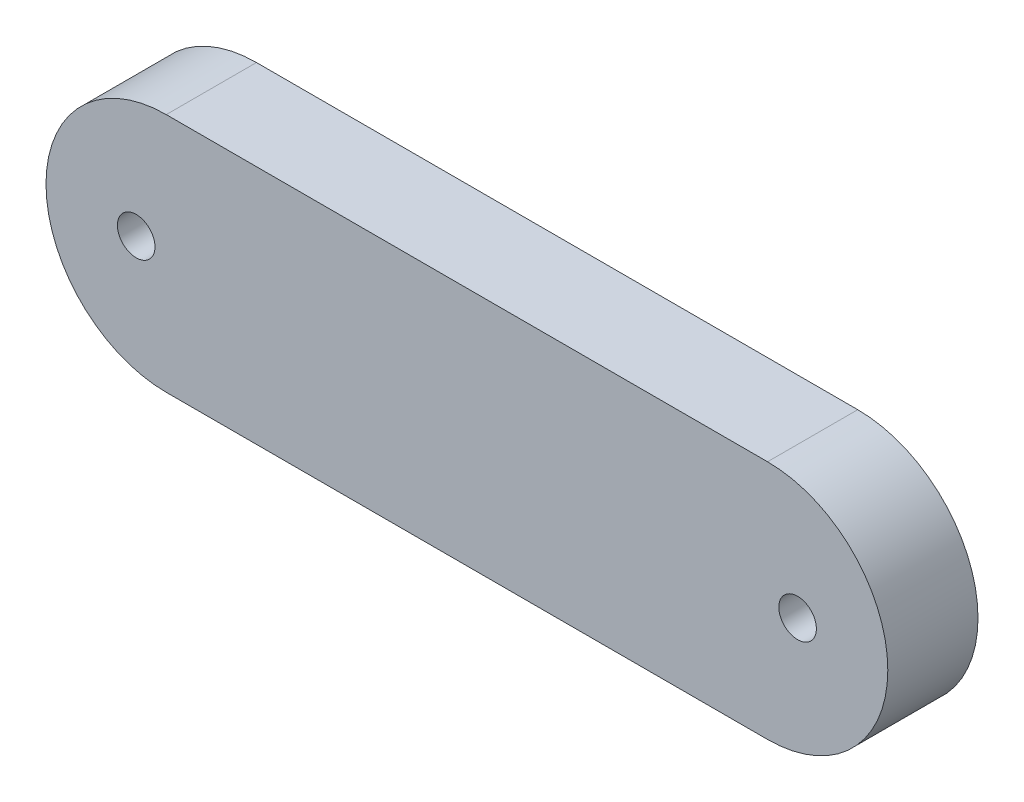
ISO-10303-21;
HEADER;
FILE_DESCRIPTION(('STEP AP214'),'2;1');
FILE_NAME('part.step','',(''),(''),'','','');
FILE_SCHEMA(('AUTOMOTIVE_DESIGN { 1 0 10303 214 1 1 1 1 }'));
ENDSEC;
DATA;
#1=APPLICATION_CONTEXT('core data for automotive mechanical design processes');
#2=APPLICATION_PROTOCOL_DEFINITION('international standard','automotive_design',2000,#1);
#3=PRODUCT_CONTEXT('',#1,'mechanical');
#4=PRODUCT('Part','Part','',(#3));
#5=PRODUCT_RELATED_PRODUCT_CATEGORY('part','',(#4));
#6=PRODUCT_DEFINITION_FORMATION('','',#4);
#7=PRODUCT_DEFINITION_CONTEXT('part definition',#1,'design');
#8=PRODUCT_DEFINITION('design','',#6,#7);
#9=PRODUCT_DEFINITION_SHAPE('','',#8);
#10=(LENGTH_UNIT() NAMED_UNIT(*) SI_UNIT(.MILLI.,.METRE.));
#11=(NAMED_UNIT(*) PLANE_ANGLE_UNIT() SI_UNIT($,.RADIAN.));
#12=(NAMED_UNIT(*) SI_UNIT($,.STERADIAN.) SOLID_ANGLE_UNIT());
#13=UNCERTAINTY_MEASURE_WITH_UNIT(LENGTH_MEASURE(1.E-05),#10,'distance_accuracy_value','');
#14=(GEOMETRIC_REPRESENTATION_CONTEXT(3) GLOBAL_UNCERTAINTY_ASSIGNED_CONTEXT((#13)) GLOBAL_UNIT_ASSIGNED_CONTEXT((#10,
#11,#12)) REPRESENTATION_CONTEXT('',''));
#15=CARTESIAN_POINT('',(0.,0.,0.));
#16=DIRECTION('',(0.,0.,1.));
#17=DIRECTION('',(1.,0.,0.));
#18=AXIS2_PLACEMENT_3D('',#15,#16,#17);
#19=CARTESIAN_POINT('',(63.5,0.,9.525));
#20=DIRECTION('',(0.,0.,-1.));
#21=DIRECTION('',(-1.,0.,0.));
#22=AXIS2_PLACEMENT_3D('',#19,#20,#21);
#23=PLANE('',#22);
#24=CARTESIAN_POINT('',(63.5,0.,9.525));
#25=DIRECTION('',(0.,0.,1.));
#26=DIRECTION('',(-1.,0.,0.));
#27=AXIS2_PLACEMENT_3D('',#24,#25,#26);
#28=CIRCLE('',#27,25.4);
#29=CARTESIAN_POINT('',(63.5,-25.4,9.525));
#30=VERTEX_POINT('',#29);
#31=CARTESIAN_POINT('',(63.5,25.4,9.525));
#32=VERTEX_POINT('',#31);
#33=EDGE_CURVE('E92',#30,#32,#28,.T.);
#34=ORIENTED_EDGE('',*,*,#33,.T.);
#35=DIRECTION('',(-1.,0.,0.));
#36=VECTOR('',#35,1.);
#37=CARTESIAN_POINT('',(-63.5,25.4,9.525));
#38=LINE('',#37,#36);
#39=CARTESIAN_POINT('',(-63.5,25.4,9.525));
#40=VERTEX_POINT('',#39);
#41=EDGE_CURVE('E87',#32,#40,#38,.T.);
#42=ORIENTED_EDGE('',*,*,#41,.T.);
#43=CARTESIAN_POINT('',(-63.5,0.,9.525));
#44=DIRECTION('',(0.,0.,1.));
#45=DIRECTION('',(1.,0.,0.));
#46=AXIS2_PLACEMENT_3D('',#43,#44,#45);
#47=CIRCLE('',#46,25.4);
#48=CARTESIAN_POINT('',(-63.5,-25.4,9.525));
#49=VERTEX_POINT('',#48);
#50=EDGE_CURVE('E90',#40,#49,#47,.T.);
#51=ORIENTED_EDGE('',*,*,#50,.T.);
#52=DIRECTION('',(1.,0.,0.));
#53=VECTOR('',#52,1.);
#54=CARTESIAN_POINT('',(-63.5,-25.4,9.525));
#55=LINE('',#54,#53);
#56=EDGE_CURVE('E57',#49,#30,#55,.T.);
#57=ORIENTED_EDGE('',*,*,#56,.T.);
#58=EDGE_LOOP('',(#34,#42,#51,#57));
#59=FACE_BOUND('',#58,.T.);
#60=CARTESIAN_POINT('',(-69.85,0.,9.525));
#61=DIRECTION('',(0.,0.,1.));
#62=DIRECTION('',(1.,0.,0.));
#63=AXIS2_PLACEMENT_3D('',#60,#61,#62);
#64=CIRCLE('',#63,3.96875);
#65=CARTESIAN_POINT('',(-73.81875,0.,9.525));
#66=VERTEX_POINT('',#65);
#67=EDGE_CURVE('E112',#66,#66,#64,.T.);
#68=ORIENTED_EDGE('',*,*,#67,.F.);
#69=EDGE_LOOP('',(#68));
#70=FACE_BOUND('',#69,.T.);
#71=CARTESIAN_POINT('',(69.85,0.,9.525));
#72=DIRECTION('',(0.,0.,1.));
#73=DIRECTION('',(1.,0.,0.));
#74=AXIS2_PLACEMENT_3D('',#71,#72,#73);
#75=CIRCLE('',#74,3.96875);
#76=CARTESIAN_POINT('',(65.88125,0.,9.525));
#77=VERTEX_POINT('',#76);
#78=EDGE_CURVE('E134',#77,#77,#75,.T.);
#79=ORIENTED_EDGE('',*,*,#78,.F.);
#80=EDGE_LOOP('',(#79));
#81=FACE_BOUND('',#80,.T.);
#82=ADVANCED_FACE('F39',(#59,#70,#81),#23,.F.);
#83=CARTESIAN_POINT('',(63.5,0.,-9.525));
#84=DIRECTION('',(0.,0.,-1.));
#85=DIRECTION('',(-1.,0.,0.));
#86=AXIS2_PLACEMENT_3D('',#83,#84,#85);
#87=PLANE('',#86);
#88=CARTESIAN_POINT('',(-69.85,0.,-9.525));
#89=DIRECTION('',(0.,0.,1.));
#90=DIRECTION('',(1.,0.,0.));
#91=AXIS2_PLACEMENT_3D('',#88,#89,#90);
#92=CIRCLE('',#91,3.96875);
#93=CARTESIAN_POINT('',(-73.81875,0.,-9.525));
#94=VERTEX_POINT('',#93);
#95=EDGE_CURVE('E130',#94,#94,#92,.T.);
#96=ORIENTED_EDGE('',*,*,#95,.T.);
#97=EDGE_LOOP('',(#96));
#98=FACE_BOUND('',#97,.T.);
#99=CARTESIAN_POINT('',(63.5,0.,-9.525));
#100=DIRECTION('',(0.,0.,1.));
#101=DIRECTION('',(-1.,0.,0.));
#102=AXIS2_PLACEMENT_3D('',#99,#100,#101);
#103=CIRCLE('',#102,25.4);
#104=CARTESIAN_POINT('',(63.5,-25.4,-9.525));
#105=VERTEX_POINT('',#104);
#106=CARTESIAN_POINT('',(63.5,25.4,-9.525));
#107=VERTEX_POINT('',#106);
#108=EDGE_CURVE('E108',#105,#107,#103,.T.);
#109=ORIENTED_EDGE('',*,*,#108,.F.);
#110=DIRECTION('',(1.,0.,0.));
#111=VECTOR('',#110,1.);
#112=CARTESIAN_POINT('',(-63.5,-25.4,-9.525));
#113=LINE('',#112,#111);
#114=CARTESIAN_POINT('',(-63.5,-25.4,-9.525));
#115=VERTEX_POINT('',#114);
#116=EDGE_CURVE('E80',#115,#105,#113,.T.);
#117=ORIENTED_EDGE('',*,*,#116,.F.);
#118=CARTESIAN_POINT('',(-63.5,0.,-9.525));
#119=DIRECTION('',(0.,0.,1.));
#120=DIRECTION('',(1.,0.,0.));
#121=AXIS2_PLACEMENT_3D('',#118,#119,#120);
#122=CIRCLE('',#121,25.4);
#123=CARTESIAN_POINT('',(-63.5,25.4,-9.525));
#124=VERTEX_POINT('',#123);
#125=EDGE_CURVE('E74',#124,#115,#122,.T.);
#126=ORIENTED_EDGE('',*,*,#125,.F.);
#127=DIRECTION('',(-1.,0.,0.));
#128=VECTOR('',#127,1.);
#129=CARTESIAN_POINT('',(-63.5,25.4,-9.525));
#130=LINE('',#129,#128);
#131=EDGE_CURVE('E97',#107,#124,#130,.T.);
#132=ORIENTED_EDGE('',*,*,#131,.F.);
#133=EDGE_LOOP('',(#109,#117,#126,#132));
#134=FACE_BOUND('',#133,.T.);
#135=CARTESIAN_POINT('',(69.85,0.,-9.525));
#136=DIRECTION('',(0.,0.,1.));
#137=DIRECTION('',(1.,0.,0.));
#138=AXIS2_PLACEMENT_3D('',#135,#136,#137);
#139=CIRCLE('',#138,3.96875);
#140=CARTESIAN_POINT('',(65.88125,0.,-9.525));
#141=VERTEX_POINT('',#140);
#142=EDGE_CURVE('E138',#141,#141,#139,.T.);
#143=ORIENTED_EDGE('',*,*,#142,.T.);
#144=EDGE_LOOP('',(#143));
#145=FACE_BOUND('',#144,.T.);
#146=ADVANCED_FACE('F125',(#98,#134,#145),#87,.T.);
#147=CARTESIAN_POINT('',(63.5,0.,9.525));
#148=DIRECTION('',(0.,0.,-1.));
#149=DIRECTION('',(-1.,0.,0.));
#150=AXIS2_PLACEMENT_3D('',#147,#148,#149);
#151=CYLINDRICAL_SURFACE('',#150,25.4);
#152=ORIENTED_EDGE('',*,*,#108,.T.);
#153=DIRECTION('',(0.,0.,-1.));
#154=VECTOR('',#153,1.);
#155=CARTESIAN_POINT('',(63.5,25.4,9.525));
#156=LINE('',#155,#154);
#157=EDGE_CURVE('E11',#32,#107,#156,.T.);
#158=ORIENTED_EDGE('',*,*,#157,.F.);
#159=ORIENTED_EDGE('',*,*,#33,.F.);
#160=DIRECTION('',(0.,0.,-1.));
#161=VECTOR('',#160,1.);
#162=CARTESIAN_POINT('',(63.5,-25.4,9.525));
#163=LINE('',#162,#161);
#164=EDGE_CURVE('E104',#30,#105,#163,.T.);
#165=ORIENTED_EDGE('',*,*,#164,.T.);
#166=EDGE_LOOP('',(#152,#158,#159,#165));
#167=FACE_BOUND('',#166,.T.);
#168=ADVANCED_FACE('F41',(#167),#151,.T.);
#169=CARTESIAN_POINT('',(-63.5,25.4,9.525));
#170=DIRECTION('',(0.,-1.,0.));
#171=DIRECTION('',(1.,0.,0.));
#172=AXIS2_PLACEMENT_3D('',#169,#170,#171);
#173=PLANE('',#172);
#174=ORIENTED_EDGE('',*,*,#131,.T.);
#175=DIRECTION('',(0.,0.,-1.));
#176=VECTOR('',#175,1.);
#177=CARTESIAN_POINT('',(-63.5,25.4,9.525));
#178=LINE('',#177,#176);
#179=EDGE_CURVE('E49',#40,#124,#178,.T.);
#180=ORIENTED_EDGE('',*,*,#179,.F.);
#181=ORIENTED_EDGE('',*,*,#41,.F.);
#182=ORIENTED_EDGE('',*,*,#157,.T.);
#183=EDGE_LOOP('',(#174,#180,#181,#182));
#184=FACE_BOUND('',#183,.T.);
#185=ADVANCED_FACE('F96',(#184),#173,.F.);
#186=CARTESIAN_POINT('',(-63.5,0.,9.525));
#187=DIRECTION('',(0.,0.,-1.));
#188=DIRECTION('',(-1.,0.,0.));
#189=AXIS2_PLACEMENT_3D('',#186,#187,#188);
#190=CYLINDRICAL_SURFACE('',#189,25.4);
#191=ORIENTED_EDGE('',*,*,#125,.T.);
#192=DIRECTION('',(0.,0.,-1.));
#193=VECTOR('',#192,1.);
#194=CARTESIAN_POINT('',(-63.5,-25.4,9.525));
#195=LINE('',#194,#193);
#196=EDGE_CURVE('E99',#49,#115,#195,.T.);
#197=ORIENTED_EDGE('',*,*,#196,.F.);
#198=ORIENTED_EDGE('',*,*,#50,.F.);
#199=ORIENTED_EDGE('',*,*,#179,.T.);
#200=EDGE_LOOP('',(#191,#197,#198,#199));
#201=FACE_BOUND('',#200,.T.);
#202=ADVANCED_FACE('F100',(#201),#190,.T.);
#203=CARTESIAN_POINT('',(-63.5,-25.4,9.525));
#204=DIRECTION('',(0.,1.,0.));
#205=DIRECTION('',(-1.,0.,0.));
#206=AXIS2_PLACEMENT_3D('',#203,#204,#205);
#207=PLANE('',#206);
#208=ORIENTED_EDGE('',*,*,#116,.T.);
#209=ORIENTED_EDGE('',*,*,#164,.F.);
#210=ORIENTED_EDGE('',*,*,#56,.F.);
#211=ORIENTED_EDGE('',*,*,#196,.T.);
#212=EDGE_LOOP('',(#208,#209,#210,#211));
#213=FACE_BOUND('',#212,.T.);
#214=ADVANCED_FACE('F122',(#213),#207,.F.);
#215=CARTESIAN_POINT('',(-69.85,0.,9.525));
#216=DIRECTION('',(0.,0.,-1.));
#217=DIRECTION('',(-1.,0.,0.));
#218=AXIS2_PLACEMENT_3D('',#215,#216,#217);
#219=CYLINDRICAL_SURFACE('',#218,3.96875);
#220=CARTESIAN_POINT('',(-73.81875,0.,9.525));
#221=CARTESIAN_POINT('',(-73.81875,0.,9.3265625));
#222=CARTESIAN_POINT('',(-73.81875,0.,9.128125));
#223=CARTESIAN_POINT('',(-73.81875,0.,8.73125));
#224=CARTESIAN_POINT('',(-73.81875,0.,8.5328125));
#225=CARTESIAN_POINT('',(-73.81875,0.,8.1359375));
#226=CARTESIAN_POINT('',(-73.81875,0.,7.9375));
#227=CARTESIAN_POINT('',(-73.81875,0.,7.540625));
#228=CARTESIAN_POINT('',(-73.81875,0.,7.3421875));
#229=CARTESIAN_POINT('',(-73.81875,0.,6.9453125));
#230=CARTESIAN_POINT('',(-73.81875,0.,6.746875));
#231=CARTESIAN_POINT('',(-73.81875,0.,6.35));
#232=CARTESIAN_POINT('',(-73.81875,0.,6.1515625));
#233=CARTESIAN_POINT('',(-73.81875,0.,5.7546875));
#234=CARTESIAN_POINT('',(-73.81875,0.,5.55625));
#235=CARTESIAN_POINT('',(-73.81875,0.,5.159375));
#236=CARTESIAN_POINT('',(-73.81875,0.,4.9609375));
#237=CARTESIAN_POINT('',(-73.81875,0.,4.5640625));
#238=CARTESIAN_POINT('',(-73.81875,0.,4.365625));
#239=CARTESIAN_POINT('',(-73.81875,0.,3.96875));
#240=CARTESIAN_POINT('',(-73.81875,0.,3.7703125));
#241=CARTESIAN_POINT('',(-73.81875,0.,3.3734375));
#242=CARTESIAN_POINT('',(-73.81875,0.,3.175));
#243=CARTESIAN_POINT('',(-73.81875,0.,2.778125));
#244=CARTESIAN_POINT('',(-73.81875,0.,2.5796875));
#245=CARTESIAN_POINT('',(-73.81875,0.,2.1828125));
#246=CARTESIAN_POINT('',(-73.81875,0.,1.984375));
#247=CARTESIAN_POINT('',(-73.81875,0.,1.5875));
#248=CARTESIAN_POINT('',(-73.81875,0.,1.3890625));
#249=CARTESIAN_POINT('',(-73.81875,0.,0.992187500000001));
#250=CARTESIAN_POINT('',(-73.81875,0.,0.793750000000001));
#251=CARTESIAN_POINT('',(-73.81875,0.,0.396875));
#252=CARTESIAN_POINT('',(-73.81875,0.,0.1984375));
#253=CARTESIAN_POINT('',(-73.81875,0.,-0.1984375));
#254=CARTESIAN_POINT('',(-73.81875,0.,-0.396875));
#255=CARTESIAN_POINT('',(-73.81875,0.,-0.793750000000001));
#256=CARTESIAN_POINT('',(-73.81875,0.,-0.992187500000001));
#257=CARTESIAN_POINT('',(-73.81875,0.,-1.3890625));
#258=CARTESIAN_POINT('',(-73.81875,0.,-1.5875));
#259=CARTESIAN_POINT('',(-73.81875,0.,-1.984375));
#260=CARTESIAN_POINT('',(-73.81875,0.,-2.1828125));
#261=CARTESIAN_POINT('',(-73.81875,0.,-2.5796875));
#262=CARTESIAN_POINT('',(-73.81875,0.,-2.778125));
#263=CARTESIAN_POINT('',(-73.81875,0.,-3.175));
#264=CARTESIAN_POINT('',(-73.81875,0.,-3.3734375));
#265=CARTESIAN_POINT('',(-73.81875,0.,-3.7703125));
#266=CARTESIAN_POINT('',(-73.81875,0.,-3.96875));
#267=CARTESIAN_POINT('',(-73.81875,0.,-4.365625));
#268=CARTESIAN_POINT('',(-73.81875,0.,-4.5640625));
#269=CARTESIAN_POINT('',(-73.81875,0.,-4.9609375));
#270=CARTESIAN_POINT('',(-73.81875,0.,-5.159375));
#271=CARTESIAN_POINT('',(-73.81875,0.,-5.55625));
#272=CARTESIAN_POINT('',(-73.81875,0.,-5.7546875));
#273=CARTESIAN_POINT('',(-73.81875,0.,-6.1515625));
#274=CARTESIAN_POINT('',(-73.81875,0.,-6.35));
#275=CARTESIAN_POINT('',(-73.81875,0.,-6.746875));
#276=CARTESIAN_POINT('',(-73.81875,0.,-6.9453125));
#277=CARTESIAN_POINT('',(-73.81875,0.,-7.3421875));
#278=CARTESIAN_POINT('',(-73.81875,0.,-7.540625));
#279=CARTESIAN_POINT('',(-73.81875,0.,-7.9375));
#280=CARTESIAN_POINT('',(-73.81875,0.,-8.1359375));
#281=CARTESIAN_POINT('',(-73.81875,0.,-8.5328125));
#282=CARTESIAN_POINT('',(-73.81875,0.,-8.73125));
#283=CARTESIAN_POINT('',(-73.81875,0.,-9.128125));
#284=CARTESIAN_POINT('',(-73.81875,0.,-9.3265625));
#285=CARTESIAN_POINT('',(-73.81875,0.,-9.525));
#286=B_SPLINE_CURVE_WITH_KNOTS('',3,(#220,#221,#222,#223,#224,#225,#226,#227,#228,#229,#230,
#231,#232,#233,#234,#235,#236,#237,#238,#239,#240,#241,#242,#243,#244,#245,#246,#247,#248,#249,
#250,#251,#252,#253,#254,#255,#256,#257,#258,#259,#260,#261,#262,#263,#264,#265,#266,#267,#268,
#269,#270,#271,#272,#273,#274,#275,#276,#277,#278,#279,#280,#281,#282,#283,#284,#285),
.UNSPECIFIED.,.F.,.F.,(4,2,2,2,2,2,2,2,2,2,2,2,2,2,2,2,2,2,2,2,2,2,2,2,2,2,2,2,2,2,2,2,4),(0.,
0.5953125,1.190625,1.7859375,2.38125,2.9765625,3.571875,4.1671875,4.7625,5.3578125,5.953125,
6.5484375,7.14375,7.7390625,8.334375,8.9296875,9.525,10.1203125,10.715625,11.3109375,11.90625,
12.5015625,13.096875,13.6921875,14.2875,14.8828125,15.478125,16.0734375,16.66875,17.2640625,
17.859375,18.4546875,19.05),.UNSPECIFIED.);
#287=EDGE_CURVE('BSEAM157',#66,#94,#286,.T.);
#288=ORIENTED_EDGE('',*,*,#67,.T.);
#289=ORIENTED_EDGE('',*,*,#95,.F.);
#290=ORIENTED_EDGE('',*,*,#287,.T.);
#291=ORIENTED_EDGE('',*,*,#287,.F.);
#292=EDGE_LOOP('',(#288,#290,#289,#291));
#293=FACE_BOUND('',#292,.T.);
#294=ADVANCED_FACE('F157',(#293),#219,.F.);
#295=CARTESIAN_POINT('',(69.85,0.,9.525));
#296=DIRECTION('',(0.,0.,-1.));
#297=DIRECTION('',(-1.,0.,0.));
#298=AXIS2_PLACEMENT_3D('',#295,#296,#297);
#299=CYLINDRICAL_SURFACE('',#298,3.96875);
#300=CARTESIAN_POINT('',(65.88125,0.,9.525));
#301=CARTESIAN_POINT('',(65.88125,0.,9.3265625));
#302=CARTESIAN_POINT('',(65.88125,0.,9.128125));
#303=CARTESIAN_POINT('',(65.88125,0.,8.73125));
#304=CARTESIAN_POINT('',(65.88125,0.,8.5328125));
#305=CARTESIAN_POINT('',(65.88125,0.,8.1359375));
#306=CARTESIAN_POINT('',(65.88125,0.,7.9375));
#307=CARTESIAN_POINT('',(65.88125,0.,7.540625));
#308=CARTESIAN_POINT('',(65.88125,0.,7.3421875));
#309=CARTESIAN_POINT('',(65.88125,0.,6.9453125));
#310=CARTESIAN_POINT('',(65.88125,0.,6.746875));
#311=CARTESIAN_POINT('',(65.88125,0.,6.35));
#312=CARTESIAN_POINT('',(65.88125,0.,6.1515625));
#313=CARTESIAN_POINT('',(65.88125,0.,5.7546875));
#314=CARTESIAN_POINT('',(65.88125,0.,5.55625));
#315=CARTESIAN_POINT('',(65.88125,0.,5.159375));
#316=CARTESIAN_POINT('',(65.88125,0.,4.9609375));
#317=CARTESIAN_POINT('',(65.88125,0.,4.5640625));
#318=CARTESIAN_POINT('',(65.88125,0.,4.365625));
#319=CARTESIAN_POINT('',(65.88125,0.,3.96875));
#320=CARTESIAN_POINT('',(65.88125,0.,3.7703125));
#321=CARTESIAN_POINT('',(65.88125,0.,3.3734375));
#322=CARTESIAN_POINT('',(65.88125,0.,3.175));
#323=CARTESIAN_POINT('',(65.88125,0.,2.778125));
#324=CARTESIAN_POINT('',(65.88125,0.,2.5796875));
#325=CARTESIAN_POINT('',(65.88125,0.,2.1828125));
#326=CARTESIAN_POINT('',(65.88125,0.,1.984375));
#327=CARTESIAN_POINT('',(65.88125,0.,1.5875));
#328=CARTESIAN_POINT('',(65.88125,0.,1.3890625));
#329=CARTESIAN_POINT('',(65.88125,0.,0.992187500000001));
#330=CARTESIAN_POINT('',(65.88125,0.,0.793750000000001));
#331=CARTESIAN_POINT('',(65.88125,0.,0.396875));
#332=CARTESIAN_POINT('',(65.88125,0.,0.1984375));
#333=CARTESIAN_POINT('',(65.88125,0.,-0.1984375));
#334=CARTESIAN_POINT('',(65.88125,0.,-0.396875));
#335=CARTESIAN_POINT('',(65.88125,0.,-0.793750000000001));
#336=CARTESIAN_POINT('',(65.88125,0.,-0.992187500000001));
#337=CARTESIAN_POINT('',(65.88125,0.,-1.3890625));
#338=CARTESIAN_POINT('',(65.88125,0.,-1.5875));
#339=CARTESIAN_POINT('',(65.88125,0.,-1.984375));
#340=CARTESIAN_POINT('',(65.88125,0.,-2.1828125));
#341=CARTESIAN_POINT('',(65.88125,0.,-2.5796875));
#342=CARTESIAN_POINT('',(65.88125,0.,-2.778125));
#343=CARTESIAN_POINT('',(65.88125,0.,-3.175));
#344=CARTESIAN_POINT('',(65.88125,0.,-3.3734375));
#345=CARTESIAN_POINT('',(65.88125,0.,-3.7703125));
#346=CARTESIAN_POINT('',(65.88125,0.,-3.96875));
#347=CARTESIAN_POINT('',(65.88125,0.,-4.365625));
#348=CARTESIAN_POINT('',(65.88125,0.,-4.5640625));
#349=CARTESIAN_POINT('',(65.88125,0.,-4.9609375));
#350=CARTESIAN_POINT('',(65.88125,0.,-5.159375));
#351=CARTESIAN_POINT('',(65.88125,0.,-5.55625));
#352=CARTESIAN_POINT('',(65.88125,0.,-5.7546875));
#353=CARTESIAN_POINT('',(65.88125,0.,-6.1515625));
#354=CARTESIAN_POINT('',(65.88125,0.,-6.35));
#355=CARTESIAN_POINT('',(65.88125,0.,-6.746875));
#356=CARTESIAN_POINT('',(65.88125,0.,-6.9453125));
#357=CARTESIAN_POINT('',(65.88125,0.,-7.3421875));
#358=CARTESIAN_POINT('',(65.88125,0.,-7.540625));
#359=CARTESIAN_POINT('',(65.88125,0.,-7.9375));
#360=CARTESIAN_POINT('',(65.88125,0.,-8.1359375));
#361=CARTESIAN_POINT('',(65.88125,0.,-8.5328125));
#362=CARTESIAN_POINT('',(65.88125,0.,-8.73125));
#363=CARTESIAN_POINT('',(65.88125,0.,-9.128125));
#364=CARTESIAN_POINT('',(65.88125,0.,-9.3265625));
#365=CARTESIAN_POINT('',(65.88125,0.,-9.525));
#366=B_SPLINE_CURVE_WITH_KNOTS('',3,(#300,#301,#302,#303,#304,#305,#306,#307,#308,#309,#310,
#311,#312,#313,#314,#315,#316,#317,#318,#319,#320,#321,#322,#323,#324,#325,#326,#327,#328,#329,
#330,#331,#332,#333,#334,#335,#336,#337,#338,#339,#340,#341,#342,#343,#344,#345,#346,#347,#348,
#349,#350,#351,#352,#353,#354,#355,#356,#357,#358,#359,#360,#361,#362,#363,#364,#365),
.UNSPECIFIED.,.F.,.F.,(4,2,2,2,2,2,2,2,2,2,2,2,2,2,2,2,2,2,2,2,2,2,2,2,2,2,2,2,2,2,2,2,4),(0.,
0.5953125,1.190625,1.7859375,2.38125,2.9765625,3.571875,4.1671875,4.7625,5.3578125,5.953125,
6.5484375,7.14375,7.7390625,8.334375,8.9296875,9.525,10.1203125,10.715625,11.3109375,11.90625,
12.5015625,13.096875,13.6921875,14.2875,14.8828125,15.478125,16.0734375,16.66875,17.2640625,
17.859375,18.4546875,19.05),.UNSPECIFIED.);
#367=EDGE_CURVE('BSEAM146',#77,#141,#366,.T.);
#368=ORIENTED_EDGE('',*,*,#78,.T.);
#369=ORIENTED_EDGE('',*,*,#142,.F.);
#370=ORIENTED_EDGE('',*,*,#367,.T.);
#371=ORIENTED_EDGE('',*,*,#367,.F.);
#372=EDGE_LOOP('',(#368,#370,#369,#371));
#373=FACE_BOUND('',#372,.T.);
#374=ADVANCED_FACE('F146',(#373),#299,.F.);
#375=CLOSED_SHELL('',(#82,#146,#168,#185,#202,#214,#294,#374));
#376=MANIFOLD_SOLID_BREP('B2',#375);
#377=ADVANCED_BREP_SHAPE_REPRESENTATION('',(#18,#376),#14);
#378=SHAPE_DEFINITION_REPRESENTATION(#9,#377);
ENDSEC;
END-ISO-10303-21;
